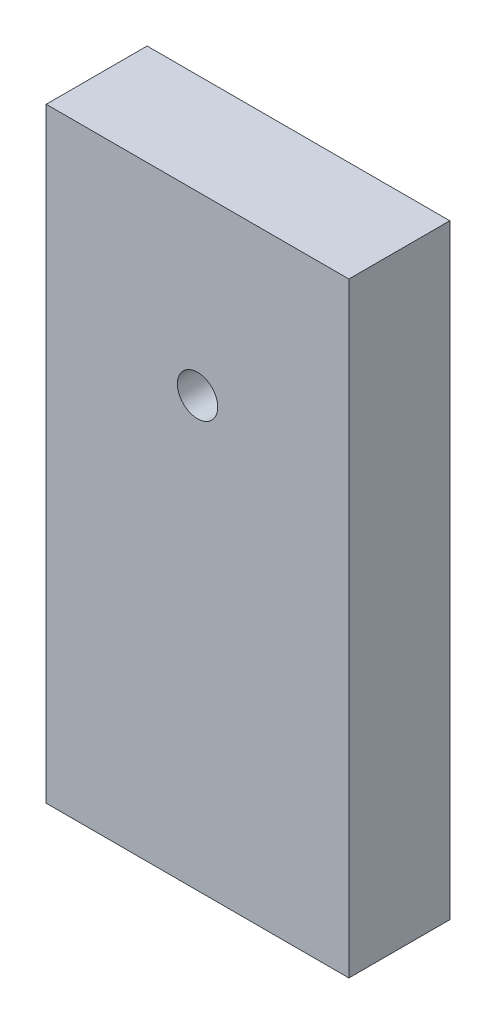
ISO-10303-21;
HEADER;
FILE_DESCRIPTION(('STEP AP214'),'2;1');
FILE_NAME('part.step','',(''),(''),'','','');
FILE_SCHEMA(('AUTOMOTIVE_DESIGN { 1 0 10303 214 1 1 1 1 }'));
ENDSEC;
DATA;
#1=APPLICATION_CONTEXT('core data for automotive mechanical design processes');
#2=APPLICATION_PROTOCOL_DEFINITION('international standard','automotive_design',2000,#1);
#3=PRODUCT_CONTEXT('',#1,'mechanical');
#4=PRODUCT('Part','Part','',(#3));
#5=PRODUCT_RELATED_PRODUCT_CATEGORY('part','',(#4));
#6=PRODUCT_DEFINITION_FORMATION('','',#4);
#7=PRODUCT_DEFINITION_CONTEXT('part definition',#1,'design');
#8=PRODUCT_DEFINITION('design','',#6,#7);
#9=PRODUCT_DEFINITION_SHAPE('','',#8);
#10=(LENGTH_UNIT() NAMED_UNIT(*) SI_UNIT(.MILLI.,.METRE.));
#11=(NAMED_UNIT(*) PLANE_ANGLE_UNIT() SI_UNIT($,.RADIAN.));
#12=(NAMED_UNIT(*) SI_UNIT($,.STERADIAN.) SOLID_ANGLE_UNIT());
#13=UNCERTAINTY_MEASURE_WITH_UNIT(LENGTH_MEASURE(1.E-05),#10,'distance_accuracy_value','');
#14=(GEOMETRIC_REPRESENTATION_CONTEXT(3) GLOBAL_UNCERTAINTY_ASSIGNED_CONTEXT((#13)) GLOBAL_UNIT_ASSIGNED_CONTEXT((#10,
#11,#12)) REPRESENTATION_CONTEXT('',''));
#15=CARTESIAN_POINT('',(0.,0.,0.));
#16=DIRECTION('',(0.,0.,1.));
#17=DIRECTION('',(1.,0.,0.));
#18=AXIS2_PLACEMENT_3D('',#15,#16,#17);
#19=CARTESIAN_POINT('',(15.,30.,10.));
#20=DIRECTION('',(-1.,0.,0.));
#21=DIRECTION('',(0.,-1.,0.));
#22=AXIS2_PLACEMENT_3D('',#19,#20,#21);
#23=PLANE('',#22);
#24=DIRECTION('',(0.,1.,0.));
#25=VECTOR('',#24,1.);
#26=CARTESIAN_POINT('',(15.,30.,0.));
#27=LINE('',#26,#25);
#28=CARTESIAN_POINT('',(15.,-30.,0.));
#29=VERTEX_POINT('',#28);
#30=CARTESIAN_POINT('',(15.,30.,0.));
#31=VERTEX_POINT('',#30);
#32=EDGE_CURVE('E96',#29,#31,#27,.T.);
#33=ORIENTED_EDGE('',*,*,#32,.T.);
#34=DIRECTION('',(0.,0.,-1.));
#35=VECTOR('',#34,1.);
#36=CARTESIAN_POINT('',(15.,30.,10.));
#37=LINE('',#36,#35);
#38=CARTESIAN_POINT('',(15.,30.,10.));
#39=VERTEX_POINT('',#38);
#40=EDGE_CURVE('E11',#39,#31,#37,.T.);
#41=ORIENTED_EDGE('',*,*,#40,.F.);
#42=DIRECTION('',(0.,1.,0.));
#43=VECTOR('',#42,1.);
#44=CARTESIAN_POINT('',(15.,30.,10.));
#45=LINE('',#44,#43);
#46=CARTESIAN_POINT('',(15.,-30.,10.));
#47=VERTEX_POINT('',#46);
#48=EDGE_CURVE('E84',#47,#39,#45,.T.);
#49=ORIENTED_EDGE('',*,*,#48,.F.);
#50=DIRECTION('',(0.,0.,-1.));
#51=VECTOR('',#50,1.);
#52=CARTESIAN_POINT('',(15.,-30.,10.));
#53=LINE('',#52,#51);
#54=EDGE_CURVE('E92',#47,#29,#53,.T.);
#55=ORIENTED_EDGE('',*,*,#54,.T.);
#56=EDGE_LOOP('',(#33,#41,#49,#55));
#57=FACE_BOUND('',#56,.T.);
#58=ADVANCED_FACE('F33',(#57),#23,.F.);
#59=CARTESIAN_POINT('',(-15.,30.,10.));
#60=DIRECTION('',(0.,-1.,0.));
#61=DIRECTION('',(0.,0.,-1.));
#62=AXIS2_PLACEMENT_3D('',#59,#60,#61);
#63=PLANE('',#62);
#64=DIRECTION('',(-1.,0.,0.));
#65=VECTOR('',#64,1.);
#66=CARTESIAN_POINT('',(-15.,30.,0.));
#67=LINE('',#66,#65);
#68=CARTESIAN_POINT('',(-15.,30.,0.));
#69=VERTEX_POINT('',#68);
#70=EDGE_CURVE('E88',#31,#69,#67,.T.);
#71=ORIENTED_EDGE('',*,*,#70,.T.);
#72=DIRECTION('',(0.,0.,-1.));
#73=VECTOR('',#72,1.);
#74=CARTESIAN_POINT('',(-15.,30.,10.));
#75=LINE('',#74,#73);
#76=CARTESIAN_POINT('',(-15.,30.,10.));
#77=VERTEX_POINT('',#76);
#78=EDGE_CURVE('E41',#77,#69,#75,.T.);
#79=ORIENTED_EDGE('',*,*,#78,.F.);
#80=DIRECTION('',(-1.,0.,0.));
#81=VECTOR('',#80,1.);
#82=CARTESIAN_POINT('',(-15.,30.,10.));
#83=LINE('',#82,#81);
#84=EDGE_CURVE('E79',#39,#77,#83,.T.);
#85=ORIENTED_EDGE('',*,*,#84,.F.);
#86=ORIENTED_EDGE('',*,*,#40,.T.);
#87=EDGE_LOOP('',(#71,#79,#85,#86));
#88=FACE_BOUND('',#87,.T.);
#89=ADVANCED_FACE('F87',(#88),#63,.F.);
#90=CARTESIAN_POINT('',(-15.,30.,10.));
#91=DIRECTION('',(1.,0.,0.));
#92=DIRECTION('',(0.,1.,0.));
#93=AXIS2_PLACEMENT_3D('',#90,#91,#92);
#94=PLANE('',#93);
#95=DIRECTION('',(0.,-1.,0.));
#96=VECTOR('',#95,1.);
#97=CARTESIAN_POINT('',(-15.,30.,0.));
#98=LINE('',#97,#96);
#99=CARTESIAN_POINT('',(-15.,-30.,0.));
#100=VERTEX_POINT('',#99);
#101=EDGE_CURVE('E66',#69,#100,#98,.T.);
#102=ORIENTED_EDGE('',*,*,#101,.T.);
#103=DIRECTION('',(0.,0.,-1.));
#104=VECTOR('',#103,1.);
#105=CARTESIAN_POINT('',(-15.,-30.,10.));
#106=LINE('',#105,#104);
#107=CARTESIAN_POINT('',(-15.,-30.,10.));
#108=VERTEX_POINT('',#107);
#109=EDGE_CURVE('E89',#108,#100,#106,.T.);
#110=ORIENTED_EDGE('',*,*,#109,.F.);
#111=DIRECTION('',(0.,-1.,0.));
#112=VECTOR('',#111,1.);
#113=CARTESIAN_POINT('',(-15.,30.,10.));
#114=LINE('',#113,#112);
#115=EDGE_CURVE('E82',#77,#108,#114,.T.);
#116=ORIENTED_EDGE('',*,*,#115,.F.);
#117=ORIENTED_EDGE('',*,*,#78,.T.);
#118=EDGE_LOOP('',(#102,#110,#116,#117));
#119=FACE_BOUND('',#118,.T.);
#120=ADVANCED_FACE('F90',(#119),#94,.F.);
#121=CARTESIAN_POINT('',(-15.,-30.,10.));
#122=DIRECTION('',(0.,1.,0.));
#123=DIRECTION('',(0.,0.,1.));
#124=AXIS2_PLACEMENT_3D('',#121,#122,#123);
#125=PLANE('',#124);
#126=DIRECTION('',(1.,0.,0.));
#127=VECTOR('',#126,1.);
#128=CARTESIAN_POINT('',(-15.,-30.,0.));
#129=LINE('',#128,#127);
#130=EDGE_CURVE('E72',#100,#29,#129,.T.);
#131=ORIENTED_EDGE('',*,*,#130,.T.);
#132=ORIENTED_EDGE('',*,*,#54,.F.);
#133=DIRECTION('',(1.,0.,0.));
#134=VECTOR('',#133,1.);
#135=CARTESIAN_POINT('',(-15.,-30.,10.));
#136=LINE('',#135,#134);
#137=EDGE_CURVE('E49',#108,#47,#136,.T.);
#138=ORIENTED_EDGE('',*,*,#137,.F.);
#139=ORIENTED_EDGE('',*,*,#109,.T.);
#140=EDGE_LOOP('',(#131,#132,#138,#139));
#141=FACE_BOUND('',#140,.T.);
#142=ADVANCED_FACE('F104',(#141),#125,.F.);
#143=CARTESIAN_POINT('',(0.,0.,10.));
#144=DIRECTION('',(0.,0.,1.));
#145=DIRECTION('',(1.,0.,0.));
#146=AXIS2_PLACEMENT_3D('',#143,#144,#145);
#147=PLANE('',#146);
#148=CARTESIAN_POINT('',(0.,12.5,10.));
#149=DIRECTION('',(0.,0.,1.));
#150=DIRECTION('',(1.,0.,0.));
#151=AXIS2_PLACEMENT_3D('',#148,#149,#150);
#152=CIRCLE('',#151,2.);
#153=CARTESIAN_POINT('',(2.,12.5,10.));
#154=VERTEX_POINT('',#153);
#155=EDGE_CURVE('E110',#154,#154,#152,.T.);
#156=ORIENTED_EDGE('',*,*,#155,.F.);
#157=EDGE_LOOP('',(#156));
#158=FACE_BOUND('',#157,.T.);
#159=ORIENTED_EDGE('',*,*,#48,.T.);
#160=ORIENTED_EDGE('',*,*,#84,.T.);
#161=ORIENTED_EDGE('',*,*,#115,.T.);
#162=ORIENTED_EDGE('',*,*,#137,.T.);
#163=EDGE_LOOP('',(#159,#160,#161,#162));
#164=FACE_BOUND('',#163,.T.);
#165=ADVANCED_FACE('F80',(#158,#164),#147,.T.);
#166=CARTESIAN_POINT('',(0.,0.,0.));
#167=DIRECTION('',(0.,0.,1.));
#168=DIRECTION('',(1.,0.,0.));
#169=AXIS2_PLACEMENT_3D('',#166,#167,#168);
#170=PLANE('',#169);
#171=CARTESIAN_POINT('',(0.,12.5,0.));
#172=DIRECTION('',(0.,0.,1.));
#173=DIRECTION('',(1.,0.,0.));
#174=AXIS2_PLACEMENT_3D('',#171,#172,#173);
#175=CIRCLE('',#174,2.);
#176=CARTESIAN_POINT('',(2.,12.5,0.));
#177=VERTEX_POINT('',#176);
#178=EDGE_CURVE('E99',#177,#177,#175,.T.);
#179=ORIENTED_EDGE('',*,*,#178,.T.);
#180=EDGE_LOOP('',(#179));
#181=FACE_BOUND('',#180,.T.);
#182=ORIENTED_EDGE('',*,*,#32,.F.);
#183=ORIENTED_EDGE('',*,*,#130,.F.);
#184=ORIENTED_EDGE('',*,*,#101,.F.);
#185=ORIENTED_EDGE('',*,*,#70,.F.);
#186=EDGE_LOOP('',(#182,#183,#184,#185));
#187=FACE_BOUND('',#186,.T.);
#188=ADVANCED_FACE('F107',(#181,#187),#170,.F.);
#189=CARTESIAN_POINT('',(0.,12.5,0.));
#190=DIRECTION('',(0.,0.,1.));
#191=DIRECTION('',(1.,0.,0.));
#192=AXIS2_PLACEMENT_3D('',#189,#190,#191);
#193=CYLINDRICAL_SURFACE('',#192,2.);
#194=ORIENTED_EDGE('',*,*,#178,.F.);
#195=EDGE_LOOP('',(#194));
#196=FACE_BOUND('',#195,.T.);
#197=ORIENTED_EDGE('',*,*,#155,.T.);
#198=EDGE_LOOP('',(#197));
#199=FACE_BOUND('',#198,.T.);
#200=ADVANCED_FACE('F117',(#196,#199),#193,.F.);
#201=CLOSED_SHELL('',(#58,#89,#120,#142,#165,#188,#200));
#202=MANIFOLD_SOLID_BREP('B2',#201);
#203=ADVANCED_BREP_SHAPE_REPRESENTATION('',(#18,#202),#14);
#204=SHAPE_DEFINITION_REPRESENTATION(#9,#203);
ENDSEC;
END-ISO-10303-21;
